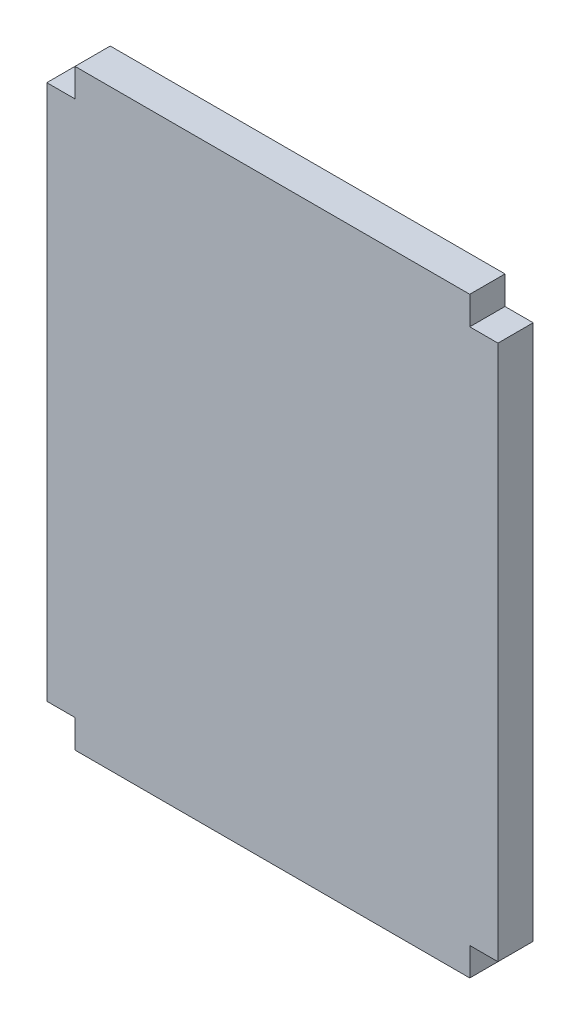
ISO-10303-21;
HEADER;
FILE_DESCRIPTION(('STEP AP214'),'2;1');
FILE_NAME('part.step','',(''),(''),'','','');
FILE_SCHEMA(('AUTOMOTIVE_DESIGN { 1 0 10303 214 1 1 1 1 }'));
ENDSEC;
DATA;
#1=APPLICATION_CONTEXT('core data for automotive mechanical design processes');
#2=APPLICATION_PROTOCOL_DEFINITION('international standard','automotive_design',2000,#1);
#3=PRODUCT_CONTEXT('',#1,'mechanical');
#4=PRODUCT('Part','Part','',(#3));
#5=PRODUCT_RELATED_PRODUCT_CATEGORY('part','',(#4));
#6=PRODUCT_DEFINITION_FORMATION('','',#4);
#7=PRODUCT_DEFINITION_CONTEXT('part definition',#1,'design');
#8=PRODUCT_DEFINITION('design','',#6,#7);
#9=PRODUCT_DEFINITION_SHAPE('','',#8);
#10=(LENGTH_UNIT() NAMED_UNIT(*) SI_UNIT(.MILLI.,.METRE.));
#11=(NAMED_UNIT(*) PLANE_ANGLE_UNIT() SI_UNIT($,.RADIAN.));
#12=(NAMED_UNIT(*) SI_UNIT($,.STERADIAN.) SOLID_ANGLE_UNIT());
#13=UNCERTAINTY_MEASURE_WITH_UNIT(LENGTH_MEASURE(1.E-05),#10,'distance_accuracy_value','');
#14=(GEOMETRIC_REPRESENTATION_CONTEXT(3) GLOBAL_UNCERTAINTY_ASSIGNED_CONTEXT((#13)) GLOBAL_UNIT_ASSIGNED_CONTEXT((#10,
#11,#12)) REPRESENTATION_CONTEXT('',''));
#15=CARTESIAN_POINT('',(0.,0.,0.));
#16=DIRECTION('',(0.,0.,1.));
#17=DIRECTION('',(1.,0.,0.));
#18=AXIS2_PLACEMENT_3D('',#15,#16,#17);
#19=CARTESIAN_POINT('',(0.,0.,50.));
#20=DIRECTION('',(1.,0.,0.));
#21=DIRECTION('',(0.,0.,-1.));
#22=AXIS2_PLACEMENT_3D('',#19,#20,#21);
#23=PLANE('',#22);
#24=DIRECTION('',(0.,-1.,0.));
#25=VECTOR('',#24,1.);
#26=CARTESIAN_POINT('',(0.,0.,50.));
#27=LINE('',#26,#25);
#28=CARTESIAN_POINT('',(0.,800.,50.));
#29=VERTEX_POINT('',#28);
#30=CARTESIAN_POINT('',(0.,40.,50.));
#31=VERTEX_POINT('',#30);
#32=EDGE_CURVE('E152',#29,#31,#27,.T.);
#33=ORIENTED_EDGE('',*,*,#32,.F.);
#34=DIRECTION('',(0.,0.,1.));
#35=VECTOR('',#34,1.);
#36=CARTESIAN_POINT('',(0.,800.,-0.001000000000001));
#37=LINE('',#36,#35);
#38=CARTESIAN_POINT('',(0.,800.,0.));
#39=VERTEX_POINT('',#38);
#40=EDGE_CURVE('E187',#39,#29,#37,.T.);
#41=ORIENTED_EDGE('',*,*,#40,.F.);
#42=DIRECTION('',(0.,-1.,0.));
#43=VECTOR('',#42,1.);
#44=CARTESIAN_POINT('',(0.,0.,0.));
#45=LINE('',#44,#43);
#46=CARTESIAN_POINT('',(0.,40.,0.));
#47=VERTEX_POINT('',#46);
#48=EDGE_CURVE('E154',#39,#47,#45,.T.);
#49=ORIENTED_EDGE('',*,*,#48,.T.);
#50=DIRECTION('',(0.,0.,1.));
#51=VECTOR('',#50,1.);
#52=CARTESIAN_POINT('',(0.,40.,-0.001000000000001));
#53=LINE('',#52,#51);
#54=EDGE_CURVE('E158',#47,#31,#53,.T.);
#55=ORIENTED_EDGE('',*,*,#54,.T.);
#56=EDGE_LOOP('',(#33,#41,#49,#55));
#57=FACE_BOUND('',#56,.T.);
#58=ADVANCED_FACE('F33',(#57),#23,.F.);
#59=CARTESIAN_POINT('',(0.,0.,50.));
#60=DIRECTION('',(0.,1.,0.));
#61=DIRECTION('',(0.,0.,1.));
#62=AXIS2_PLACEMENT_3D('',#59,#60,#61);
#63=PLANE('',#62);
#64=DIRECTION('',(1.,0.,0.));
#65=VECTOR('',#64,1.);
#66=CARTESIAN_POINT('',(0.,0.,0.));
#67=LINE('',#66,#65);
#68=CARTESIAN_POINT('',(40.,0.,0.));
#69=VERTEX_POINT('',#68);
#70=CARTESIAN_POINT('',(600.,0.,0.));
#71=VERTEX_POINT('',#70);
#72=EDGE_CURVE('E150',#69,#71,#67,.T.);
#73=ORIENTED_EDGE('',*,*,#72,.T.);
#74=DIRECTION('',(0.,0.,1.));
#75=VECTOR('',#74,1.);
#76=CARTESIAN_POINT('',(600.,0.,-0.001000000000001));
#77=LINE('',#76,#75);
#78=CARTESIAN_POINT('',(600.,0.,50.));
#79=VERTEX_POINT('',#78);
#80=EDGE_CURVE('E134',#71,#79,#77,.T.);
#81=ORIENTED_EDGE('',*,*,#80,.T.);
#82=DIRECTION('',(1.,0.,0.));
#83=VECTOR('',#82,1.);
#84=CARTESIAN_POINT('',(0.,0.,50.));
#85=LINE('',#84,#83);
#86=CARTESIAN_POINT('',(40.,0.,50.));
#87=VERTEX_POINT('',#86);
#88=EDGE_CURVE('E161',#87,#79,#85,.T.);
#89=ORIENTED_EDGE('',*,*,#88,.F.);
#90=DIRECTION('',(0.,0.,1.));
#91=VECTOR('',#90,1.);
#92=CARTESIAN_POINT('',(40.,0.,-0.001000000000001));
#93=LINE('',#92,#91);
#94=EDGE_CURVE('E166',#69,#87,#93,.T.);
#95=ORIENTED_EDGE('',*,*,#94,.F.);
#96=EDGE_LOOP('',(#73,#81,#89,#95));
#97=FACE_BOUND('',#96,.T.);
#98=ADVANCED_FACE('F220',(#97),#63,.F.);
#99=CARTESIAN_POINT('',(640.,0.,50.));
#100=DIRECTION('',(-1.,0.,0.));
#101=DIRECTION('',(0.,0.,1.));
#102=AXIS2_PLACEMENT_3D('',#99,#100,#101);
#103=PLANE('',#102);
#104=DIRECTION('',(0.,1.,0.));
#105=VECTOR('',#104,1.);
#106=CARTESIAN_POINT('',(640.,0.,0.));
#107=LINE('',#106,#105);
#108=CARTESIAN_POINT('',(640.,40.,0.));
#109=VERTEX_POINT('',#108);
#110=CARTESIAN_POINT('',(640.,800.,0.));
#111=VERTEX_POINT('',#110);
#112=EDGE_CURVE('E141',#109,#111,#107,.T.);
#113=ORIENTED_EDGE('',*,*,#112,.T.);
#114=DIRECTION('',(0.,0.,1.));
#115=VECTOR('',#114,1.);
#116=CARTESIAN_POINT('',(640.,800.,-0.001000000000001));
#117=LINE('',#116,#115);
#118=CARTESIAN_POINT('',(640.,800.,50.));
#119=VERTEX_POINT('',#118);
#120=EDGE_CURVE('E202',#111,#119,#117,.T.);
#121=ORIENTED_EDGE('',*,*,#120,.T.);
#122=DIRECTION('',(0.,1.,0.));
#123=VECTOR('',#122,1.);
#124=CARTESIAN_POINT('',(640.,0.,50.));
#125=LINE('',#124,#123);
#126=CARTESIAN_POINT('',(640.,40.,50.));
#127=VERTEX_POINT('',#126);
#128=EDGE_CURVE('E41',#127,#119,#125,.T.);
#129=ORIENTED_EDGE('',*,*,#128,.F.);
#130=DIRECTION('',(0.,0.,1.));
#131=VECTOR('',#130,1.);
#132=CARTESIAN_POINT('',(640.,40.,-0.001000000000001));
#133=LINE('',#132,#131);
#134=EDGE_CURVE('E126',#109,#127,#133,.T.);
#135=ORIENTED_EDGE('',*,*,#134,.F.);
#136=EDGE_LOOP('',(#113,#121,#129,#135));
#137=FACE_BOUND('',#136,.T.);
#138=ADVANCED_FACE('F139',(#137),#103,.F.);
#139=CARTESIAN_POINT('',(0.,840.,50.));
#140=DIRECTION('',(0.,-1.,0.));
#141=DIRECTION('',(0.,0.,-1.));
#142=AXIS2_PLACEMENT_3D('',#139,#140,#141);
#143=PLANE('',#142);
#144=DIRECTION('',(-1.,0.,0.));
#145=VECTOR('',#144,1.);
#146=CARTESIAN_POINT('',(0.,840.,0.));
#147=LINE('',#146,#145);
#148=CARTESIAN_POINT('',(600.,840.,0.));
#149=VERTEX_POINT('',#148);
#150=CARTESIAN_POINT('',(40.,840.,0.));
#151=VERTEX_POINT('',#150);
#152=EDGE_CURVE('E36',#149,#151,#147,.T.);
#153=ORIENTED_EDGE('',*,*,#152,.T.);
#154=DIRECTION('',(0.,0.,1.));
#155=VECTOR('',#154,1.);
#156=CARTESIAN_POINT('',(40.,840.,-0.001000000000001));
#157=LINE('',#156,#155);
#158=CARTESIAN_POINT('',(40.,840.,50.));
#159=VERTEX_POINT('',#158);
#160=EDGE_CURVE('E186',#151,#159,#157,.T.);
#161=ORIENTED_EDGE('',*,*,#160,.T.);
#162=DIRECTION('',(-1.,0.,0.));
#163=VECTOR('',#162,1.);
#164=CARTESIAN_POINT('',(0.,840.,50.));
#165=LINE('',#164,#163);
#166=CARTESIAN_POINT('',(600.,840.,50.));
#167=VERTEX_POINT('',#166);
#168=EDGE_CURVE('E11',#167,#159,#165,.T.);
#169=ORIENTED_EDGE('',*,*,#168,.F.);
#170=DIRECTION('',(0.,0.,1.));
#171=VECTOR('',#170,1.);
#172=CARTESIAN_POINT('',(600.,840.,-0.001000000000001));
#173=LINE('',#172,#171);
#174=EDGE_CURVE('E198',#149,#167,#173,.T.);
#175=ORIENTED_EDGE('',*,*,#174,.F.);
#176=EDGE_LOOP('',(#153,#161,#169,#175));
#177=FACE_BOUND('',#176,.T.);
#178=ADVANCED_FACE('F245',(#177),#143,.F.);
#179=CARTESIAN_POINT('',(0.,0.,50.));
#180=DIRECTION('',(0.,0.,-1.));
#181=DIRECTION('',(-1.,0.,0.));
#182=AXIS2_PLACEMENT_3D('',#179,#180,#181);
#183=PLANE('',#182);
#184=ORIENTED_EDGE('',*,*,#168,.T.);
#185=DIRECTION('',(0.,1.,0.));
#186=VECTOR('',#185,1.);
#187=CARTESIAN_POINT('',(40.,840.,50.));
#188=LINE('',#187,#186);
#189=CARTESIAN_POINT('',(40.,800.,50.));
#190=VERTEX_POINT('',#189);
#191=EDGE_CURVE('E189',#190,#159,#188,.T.);
#192=ORIENTED_EDGE('',*,*,#191,.F.);
#193=DIRECTION('',(1.,0.,0.));
#194=VECTOR('',#193,1.);
#195=CARTESIAN_POINT('',(0.,800.,50.));
#196=LINE('',#195,#194);
#197=EDGE_CURVE('E194',#29,#190,#196,.T.);
#198=ORIENTED_EDGE('',*,*,#197,.F.);
#199=ORIENTED_EDGE('',*,*,#32,.T.);
#200=DIRECTION('',(-1.,0.,0.));
#201=VECTOR('',#200,1.);
#202=CARTESIAN_POINT('',(0.,40.,50.));
#203=LINE('',#202,#201);
#204=CARTESIAN_POINT('',(40.,40.,50.));
#205=VERTEX_POINT('',#204);
#206=EDGE_CURVE('E169',#205,#31,#203,.T.);
#207=ORIENTED_EDGE('',*,*,#206,.F.);
#208=DIRECTION('',(0.,1.,0.));
#209=VECTOR('',#208,1.);
#210=CARTESIAN_POINT('',(40.,0.,50.));
#211=LINE('',#210,#209);
#212=EDGE_CURVE('E174',#87,#205,#211,.T.);
#213=ORIENTED_EDGE('',*,*,#212,.F.);
#214=ORIENTED_EDGE('',*,*,#88,.T.);
#215=DIRECTION('',(0.,-1.,0.));
#216=VECTOR('',#215,1.);
#217=CARTESIAN_POINT('',(600.,0.,50.));
#218=LINE('',#217,#216);
#219=CARTESIAN_POINT('',(600.,40.,50.));
#220=VERTEX_POINT('',#219);
#221=EDGE_CURVE('E143',#220,#79,#218,.T.);
#222=ORIENTED_EDGE('',*,*,#221,.F.);
#223=DIRECTION('',(-1.,0.,0.));
#224=VECTOR('',#223,1.);
#225=CARTESIAN_POINT('',(640.,40.,50.));
#226=LINE('',#225,#224);
#227=EDGE_CURVE('E214',#127,#220,#226,.T.);
#228=ORIENTED_EDGE('',*,*,#227,.F.);
#229=ORIENTED_EDGE('',*,*,#128,.T.);
#230=DIRECTION('',(1.,0.,0.));
#231=VECTOR('',#230,1.);
#232=CARTESIAN_POINT('',(640.,800.,50.));
#233=LINE('',#232,#231);
#234=CARTESIAN_POINT('',(600.,800.,50.));
#235=VERTEX_POINT('',#234);
#236=EDGE_CURVE('E200',#235,#119,#233,.T.);
#237=ORIENTED_EDGE('',*,*,#236,.F.);
#238=DIRECTION('',(0.,-1.,0.));
#239=VECTOR('',#238,1.);
#240=CARTESIAN_POINT('',(600.,840.,50.));
#241=LINE('',#240,#239);
#242=EDGE_CURVE('E206',#167,#235,#241,.T.);
#243=ORIENTED_EDGE('',*,*,#242,.F.);
#244=EDGE_LOOP('',(#184,#192,#198,#199,#207,#213,#214,#222,#228,#229,#237,#243));
#245=FACE_BOUND('',#244,.T.);
#246=ADVANCED_FACE('F227',(#245),#183,.F.);
#247=CARTESIAN_POINT('',(0.,0.,0.));
#248=DIRECTION('',(0.,0.,-1.));
#249=DIRECTION('',(-1.,0.,0.));
#250=AXIS2_PLACEMENT_3D('',#247,#248,#249);
#251=PLANE('',#250);
#252=DIRECTION('',(0.,1.,0.));
#253=VECTOR('',#252,1.);
#254=CARTESIAN_POINT('',(40.,840.,0.));
#255=LINE('',#254,#253);
#256=CARTESIAN_POINT('',(40.,800.,0.));
#257=VERTEX_POINT('',#256);
#258=EDGE_CURVE('E196',#257,#151,#255,.T.);
#259=ORIENTED_EDGE('',*,*,#258,.T.);
#260=ORIENTED_EDGE('',*,*,#152,.F.);
#261=DIRECTION('',(0.,-1.,0.));
#262=VECTOR('',#261,1.);
#263=CARTESIAN_POINT('',(600.,840.,0.));
#264=LINE('',#263,#262);
#265=CARTESIAN_POINT('',(600.,800.,0.));
#266=VERTEX_POINT('',#265);
#267=EDGE_CURVE('E185',#149,#266,#264,.T.);
#268=ORIENTED_EDGE('',*,*,#267,.T.);
#269=DIRECTION('',(1.,0.,0.));
#270=VECTOR('',#269,1.);
#271=CARTESIAN_POINT('',(640.,800.,0.));
#272=LINE('',#271,#270);
#273=EDGE_CURVE('E149',#266,#111,#272,.T.);
#274=ORIENTED_EDGE('',*,*,#273,.T.);
#275=ORIENTED_EDGE('',*,*,#112,.F.);
#276=DIRECTION('',(-1.,0.,0.));
#277=VECTOR('',#276,1.);
#278=CARTESIAN_POINT('',(640.,40.,0.));
#279=LINE('',#278,#277);
#280=CARTESIAN_POINT('',(600.,40.,0.));
#281=VERTEX_POINT('',#280);
#282=EDGE_CURVE('E122',#109,#281,#279,.T.);
#283=ORIENTED_EDGE('',*,*,#282,.T.);
#284=DIRECTION('',(0.,-1.,0.));
#285=VECTOR('',#284,1.);
#286=CARTESIAN_POINT('',(600.,0.,0.));
#287=LINE('',#286,#285);
#288=EDGE_CURVE('E204',#281,#71,#287,.T.);
#289=ORIENTED_EDGE('',*,*,#288,.T.);
#290=ORIENTED_EDGE('',*,*,#72,.F.);
#291=DIRECTION('',(0.,1.,0.));
#292=VECTOR('',#291,1.);
#293=CARTESIAN_POINT('',(40.,0.,0.));
#294=LINE('',#293,#292);
#295=CARTESIAN_POINT('',(40.,40.,0.));
#296=VERTEX_POINT('',#295);
#297=EDGE_CURVE('E133',#69,#296,#294,.T.);
#298=ORIENTED_EDGE('',*,*,#297,.T.);
#299=DIRECTION('',(-1.,0.,0.));
#300=VECTOR('',#299,1.);
#301=CARTESIAN_POINT('',(0.,40.,0.));
#302=LINE('',#301,#300);
#303=EDGE_CURVE('E177',#296,#47,#302,.T.);
#304=ORIENTED_EDGE('',*,*,#303,.T.);
#305=ORIENTED_EDGE('',*,*,#48,.F.);
#306=DIRECTION('',(1.,0.,0.));
#307=VECTOR('',#306,1.);
#308=CARTESIAN_POINT('',(0.,800.,0.));
#309=LINE('',#308,#307);
#310=EDGE_CURVE('E182',#39,#257,#309,.T.);
#311=ORIENTED_EDGE('',*,*,#310,.T.);
#312=EDGE_LOOP('',(#259,#260,#268,#274,#275,#283,#289,#290,#298,#304,#305,#311));
#313=FACE_BOUND('',#312,.T.);
#314=ADVANCED_FACE('F147',(#313),#251,.T.);
#315=CARTESIAN_POINT('',(0.,40.,-0.001000000000001));
#316=DIRECTION('',(0.,1.,0.));
#317=DIRECTION('',(-1.,0.,0.));
#318=AXIS2_PLACEMENT_3D('',#315,#316,#317);
#319=PLANE('',#318);
#320=DIRECTION('',(0.,0.,1.));
#321=VECTOR('',#320,1.);
#322=CARTESIAN_POINT('',(40.,40.,-0.001000000000001));
#323=LINE('',#322,#321);
#324=EDGE_CURVE('E168',#296,#205,#323,.T.);
#325=ORIENTED_EDGE('',*,*,#324,.T.);
#326=ORIENTED_EDGE('',*,*,#206,.T.);
#327=ORIENTED_EDGE('',*,*,#54,.F.);
#328=ORIENTED_EDGE('',*,*,#303,.F.);
#329=EDGE_LOOP('',(#325,#326,#327,#328));
#330=FACE_BOUND('',#329,.T.);
#331=ADVANCED_FACE('F232',(#330),#319,.F.);
#332=CARTESIAN_POINT('',(40.,0.,-0.001000000000001));
#333=DIRECTION('',(1.,0.,0.));
#334=DIRECTION('',(0.,0.,-1.));
#335=AXIS2_PLACEMENT_3D('',#332,#333,#334);
#336=PLANE('',#335);
#337=ORIENTED_EDGE('',*,*,#94,.T.);
#338=ORIENTED_EDGE('',*,*,#212,.T.);
#339=ORIENTED_EDGE('',*,*,#324,.F.);
#340=ORIENTED_EDGE('',*,*,#297,.F.);
#341=EDGE_LOOP('',(#337,#338,#339,#340));
#342=FACE_BOUND('',#341,.T.);
#343=ADVANCED_FACE('F224',(#342),#336,.F.);
#344=CARTESIAN_POINT('',(600.,0.,-0.001000000000001));
#345=DIRECTION('',(-1.,0.,0.));
#346=DIRECTION('',(0.,0.,1.));
#347=AXIS2_PLACEMENT_3D('',#344,#345,#346);
#348=PLANE('',#347);
#349=DIRECTION('',(0.,0.,1.));
#350=VECTOR('',#349,1.);
#351=CARTESIAN_POINT('',(600.,40.,-0.001000000000001));
#352=LINE('',#351,#350);
#353=EDGE_CURVE('E128',#281,#220,#352,.T.);
#354=ORIENTED_EDGE('',*,*,#353,.T.);
#355=ORIENTED_EDGE('',*,*,#221,.T.);
#356=ORIENTED_EDGE('',*,*,#80,.F.);
#357=ORIENTED_EDGE('',*,*,#288,.F.);
#358=EDGE_LOOP('',(#354,#355,#356,#357));
#359=FACE_BOUND('',#358,.T.);
#360=ADVANCED_FACE('F258',(#359),#348,.F.);
#361=CARTESIAN_POINT('',(640.,40.,-0.001000000000001));
#362=DIRECTION('',(0.,1.,0.));
#363=DIRECTION('',(-1.,0.,0.));
#364=AXIS2_PLACEMENT_3D('',#361,#362,#363);
#365=PLANE('',#364);
#366=ORIENTED_EDGE('',*,*,#134,.T.);
#367=ORIENTED_EDGE('',*,*,#227,.T.);
#368=ORIENTED_EDGE('',*,*,#353,.F.);
#369=ORIENTED_EDGE('',*,*,#282,.F.);
#370=EDGE_LOOP('',(#366,#367,#368,#369));
#371=FACE_BOUND('',#370,.T.);
#372=ADVANCED_FACE('F124',(#371),#365,.F.);
#373=CARTESIAN_POINT('',(640.,800.,-0.001000000000001));
#374=DIRECTION('',(0.,-1.,0.));
#375=DIRECTION('',(0.,0.,-1.));
#376=AXIS2_PLACEMENT_3D('',#373,#374,#375);
#377=PLANE('',#376);
#378=DIRECTION('',(0.,0.,1.));
#379=VECTOR('',#378,1.);
#380=CARTESIAN_POINT('',(600.,800.,-0.001000000000001));
#381=LINE('',#380,#379);
#382=EDGE_CURVE('E57',#266,#235,#381,.T.);
#383=ORIENTED_EDGE('',*,*,#382,.T.);
#384=ORIENTED_EDGE('',*,*,#236,.T.);
#385=ORIENTED_EDGE('',*,*,#120,.F.);
#386=ORIENTED_EDGE('',*,*,#273,.F.);
#387=EDGE_LOOP('',(#383,#384,#385,#386));
#388=FACE_BOUND('',#387,.T.);
#389=ADVANCED_FACE('F250',(#388),#377,.F.);
#390=CARTESIAN_POINT('',(600.,840.,-0.001000000000001));
#391=DIRECTION('',(-1.,0.,0.));
#392=DIRECTION('',(0.,-1.,0.));
#393=AXIS2_PLACEMENT_3D('',#390,#391,#392);
#394=PLANE('',#393);
#395=ORIENTED_EDGE('',*,*,#174,.T.);
#396=ORIENTED_EDGE('',*,*,#242,.T.);
#397=ORIENTED_EDGE('',*,*,#382,.F.);
#398=ORIENTED_EDGE('',*,*,#267,.F.);
#399=EDGE_LOOP('',(#395,#396,#397,#398));
#400=FACE_BOUND('',#399,.T.);
#401=ADVANCED_FACE('F247',(#400),#394,.F.);
#402=CARTESIAN_POINT('',(40.,840.,-0.001000000000001));
#403=DIRECTION('',(1.,0.,0.));
#404=DIRECTION('',(0.,1.,0.));
#405=AXIS2_PLACEMENT_3D('',#402,#403,#404);
#406=PLANE('',#405);
#407=DIRECTION('',(0.,0.,1.));
#408=VECTOR('',#407,1.);
#409=CARTESIAN_POINT('',(40.,800.,-0.001000000000001));
#410=LINE('',#409,#408);
#411=EDGE_CURVE('E49',#257,#190,#410,.T.);
#412=ORIENTED_EDGE('',*,*,#411,.T.);
#413=ORIENTED_EDGE('',*,*,#191,.T.);
#414=ORIENTED_EDGE('',*,*,#160,.F.);
#415=ORIENTED_EDGE('',*,*,#258,.F.);
#416=EDGE_LOOP('',(#412,#413,#414,#415));
#417=FACE_BOUND('',#416,.T.);
#418=ADVANCED_FACE('F243',(#417),#406,.F.);
#419=CARTESIAN_POINT('',(0.,800.,-0.001000000000001));
#420=DIRECTION('',(0.,-1.,0.));
#421=DIRECTION('',(0.,0.,-1.));
#422=AXIS2_PLACEMENT_3D('',#419,#420,#421);
#423=PLANE('',#422);
#424=ORIENTED_EDGE('',*,*,#40,.T.);
#425=ORIENTED_EDGE('',*,*,#197,.T.);
#426=ORIENTED_EDGE('',*,*,#411,.F.);
#427=ORIENTED_EDGE('',*,*,#310,.F.);
#428=EDGE_LOOP('',(#424,#425,#426,#427));
#429=FACE_BOUND('',#428,.T.);
#430=ADVANCED_FACE('F238',(#429),#423,.F.);
#431=CLOSED_SHELL('',(#58,#98,#138,#178,#246,#314,#331,#343,#360,#372,#389,#401,#418,#430));
#432=MANIFOLD_SOLID_BREP('B2',#431);
#433=ADVANCED_BREP_SHAPE_REPRESENTATION('',(#18,#432),#14);
#434=SHAPE_DEFINITION_REPRESENTATION(#9,#433);
ENDSEC;
END-ISO-10303-21;
